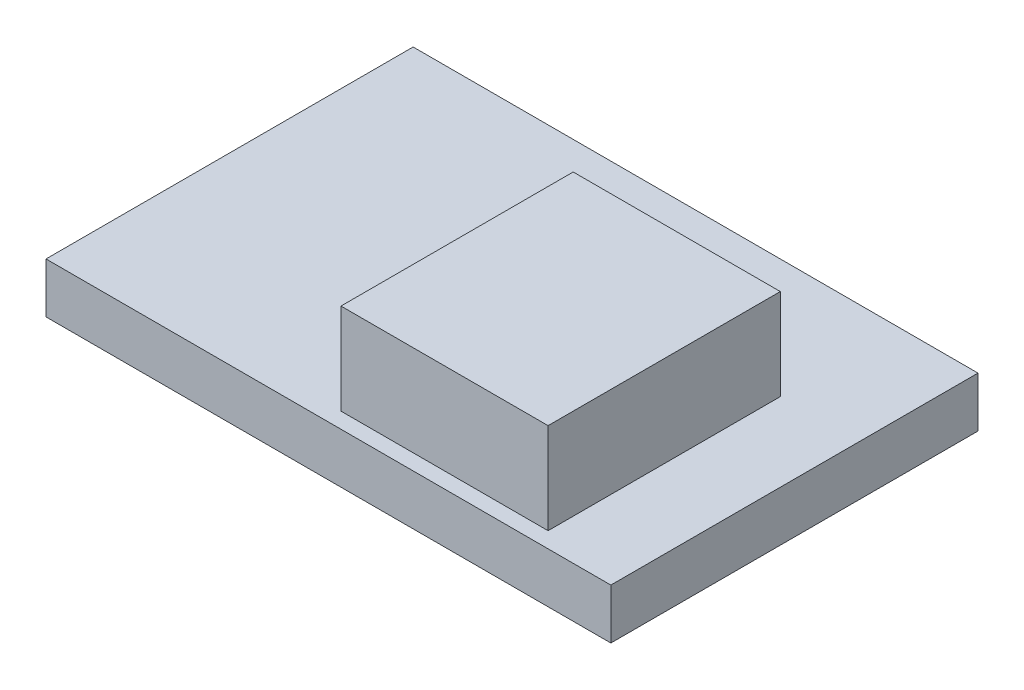
ISO-10303-21;
HEADER;
FILE_DESCRIPTION(('STEP AP214'),'2;1');
FILE_NAME('part.step','',(''),(''),'','','');
FILE_SCHEMA(('AUTOMOTIVE_DESIGN { 1 0 10303 214 1 1 1 1 }'));
ENDSEC;
DATA;
#1=APPLICATION_CONTEXT('core data for automotive mechanical design processes');
#2=APPLICATION_PROTOCOL_DEFINITION('international standard','automotive_design',2000,#1);
#3=PRODUCT_CONTEXT('',#1,'mechanical');
#4=PRODUCT('Part','Part','',(#3));
#5=PRODUCT_RELATED_PRODUCT_CATEGORY('part','',(#4));
#6=PRODUCT_DEFINITION_FORMATION('','',#4);
#7=PRODUCT_DEFINITION_CONTEXT('part definition',#1,'design');
#8=PRODUCT_DEFINITION('design','',#6,#7);
#9=PRODUCT_DEFINITION_SHAPE('','',#8);
#10=(LENGTH_UNIT() NAMED_UNIT(*) SI_UNIT(.MILLI.,.METRE.));
#11=(NAMED_UNIT(*) PLANE_ANGLE_UNIT() SI_UNIT($,.RADIAN.));
#12=(NAMED_UNIT(*) SI_UNIT($,.STERADIAN.) SOLID_ANGLE_UNIT());
#13=UNCERTAINTY_MEASURE_WITH_UNIT(LENGTH_MEASURE(1.E-05),#10,'distance_accuracy_value','');
#14=(GEOMETRIC_REPRESENTATION_CONTEXT(3) GLOBAL_UNCERTAINTY_ASSIGNED_CONTEXT((#13)) GLOBAL_UNIT_ASSIGNED_CONTEXT((#10,
#11,#12)) REPRESENTATION_CONTEXT('',''));
#15=CARTESIAN_POINT('',(0.,0.,0.));
#16=DIRECTION('',(0.,0.,1.));
#17=DIRECTION('',(1.,0.,0.));
#18=AXIS2_PLACEMENT_3D('',#15,#16,#17);
#19=CARTESIAN_POINT('',(0.,1.6,0.));
#20=DIRECTION('',(0.,1.,0.));
#21=DIRECTION('',(0.,0.,1.));
#22=AXIS2_PLACEMENT_3D('',#19,#20,#21);
#23=PLANE('',#22);
#24=DIRECTION('',(0.,0.,1.));
#25=VECTOR('',#24,1.);
#26=CARTESIAN_POINT('',(-9.,1.6,-5.85));
#27=LINE('',#26,#25);
#28=CARTESIAN_POINT('',(-9.,1.6,-5.85));
#29=VERTEX_POINT('',#28);
#30=CARTESIAN_POINT('',(-9.,1.6,5.85));
#31=VERTEX_POINT('',#30);
#32=EDGE_CURVE('E139',#29,#31,#27,.T.);
#33=ORIENTED_EDGE('',*,*,#32,.T.);
#34=DIRECTION('',(1.,0.,0.));
#35=VECTOR('',#34,1.);
#36=CARTESIAN_POINT('',(-9.,1.6,5.85));
#37=LINE('',#36,#35);
#38=CARTESIAN_POINT('',(9.,1.6,5.85));
#39=VERTEX_POINT('',#38);
#40=EDGE_CURVE('E84',#31,#39,#37,.T.);
#41=ORIENTED_EDGE('',*,*,#40,.T.);
#42=DIRECTION('',(0.,0.,-1.));
#43=VECTOR('',#42,1.);
#44=CARTESIAN_POINT('',(9.,1.6,-5.85));
#45=LINE('',#44,#43);
#46=CARTESIAN_POINT('',(9.,1.6,-5.85));
#47=VERTEX_POINT('',#46);
#48=EDGE_CURVE('E142',#39,#47,#45,.T.);
#49=ORIENTED_EDGE('',*,*,#48,.T.);
#50=DIRECTION('',(-1.,0.,0.));
#51=VECTOR('',#50,1.);
#52=CARTESIAN_POINT('',(-9.,1.6,-5.85));
#53=LINE('',#52,#51);
#54=EDGE_CURVE('E56',#47,#29,#53,.T.);
#55=ORIENTED_EDGE('',*,*,#54,.T.);
#56=EDGE_LOOP('',(#33,#41,#49,#55));
#57=FACE_BOUND('',#56,.T.);
#58=DIRECTION('',(1.,0.,0.));
#59=VECTOR('',#58,1.);
#60=CARTESIAN_POINT('',(-0.1,1.6,5.35));
#61=LINE('',#60,#59);
#62=CARTESIAN_POINT('',(-0.1,1.6,5.35));
#63=VERTEX_POINT('',#62);
#64=CARTESIAN_POINT('',(6.5,1.6,5.35));
#65=VERTEX_POINT('',#64);
#66=EDGE_CURVE('E262',#63,#65,#61,.T.);
#67=ORIENTED_EDGE('',*,*,#66,.F.);
#68=DIRECTION('',(0.,0.,1.));
#69=VECTOR('',#68,1.);
#70=CARTESIAN_POINT('',(-0.100000000000001,1.6,-2.05));
#71=LINE('',#70,#69);
#72=CARTESIAN_POINT('',(-0.100000000000001,1.6,-2.05));
#73=VERTEX_POINT('',#72);
#74=EDGE_CURVE('E129',#73,#63,#71,.T.);
#75=ORIENTED_EDGE('',*,*,#74,.F.);
#76=DIRECTION('',(-1.,0.,0.));
#77=VECTOR('',#76,1.);
#78=CARTESIAN_POINT('',(-0.100000000000001,1.6,-2.05));
#79=LINE('',#78,#77);
#80=CARTESIAN_POINT('',(6.5,1.6,-2.05));
#81=VERTEX_POINT('',#80);
#82=EDGE_CURVE('E125',#81,#73,#79,.T.);
#83=ORIENTED_EDGE('',*,*,#82,.F.);
#84=DIRECTION('',(0.,0.,-1.));
#85=VECTOR('',#84,1.);
#86=CARTESIAN_POINT('',(6.5,1.6,-2.05));
#87=LINE('',#86,#85);
#88=EDGE_CURVE('E259',#65,#81,#87,.T.);
#89=ORIENTED_EDGE('',*,*,#88,.F.);
#90=EDGE_LOOP('',(#67,#75,#83,#89));
#91=FACE_BOUND('',#90,.T.);
#92=ADVANCED_FACE('F32',(#57,#91),#23,.T.);
#93=CARTESIAN_POINT('',(-9.,1.6,-5.85));
#94=DIRECTION('',(1.,0.,0.));
#95=DIRECTION('',(0.,0.,-1.));
#96=AXIS2_PLACEMENT_3D('',#93,#94,#95);
#97=PLANE('',#96);
#98=DIRECTION('',(0.,0.,1.));
#99=VECTOR('',#98,1.);
#100=CARTESIAN_POINT('',(-9.,0.,-5.85));
#101=LINE('',#100,#99);
#102=CARTESIAN_POINT('',(-9.,0.,-5.85));
#103=VERTEX_POINT('',#102);
#104=CARTESIAN_POINT('',(-9.,0.,5.85));
#105=VERTEX_POINT('',#104);
#106=EDGE_CURVE('E131',#103,#105,#101,.T.);
#107=ORIENTED_EDGE('',*,*,#106,.T.);
#108=DIRECTION('',(0.,-1.,0.));
#109=VECTOR('',#108,1.);
#110=CARTESIAN_POINT('',(-9.,1.6,5.85));
#111=LINE('',#110,#109);
#112=EDGE_CURVE('E11',#31,#105,#111,.T.);
#113=ORIENTED_EDGE('',*,*,#112,.F.);
#114=ORIENTED_EDGE('',*,*,#32,.F.);
#115=DIRECTION('',(0.,-1.,0.));
#116=VECTOR('',#115,1.);
#117=CARTESIAN_POINT('',(-9.,1.6,-5.85));
#118=LINE('',#117,#116);
#119=EDGE_CURVE('E144',#29,#103,#118,.T.);
#120=ORIENTED_EDGE('',*,*,#119,.T.);
#121=EDGE_LOOP('',(#107,#113,#114,#120));
#122=FACE_BOUND('',#121,.T.);
#123=ADVANCED_FACE('F34',(#122),#97,.F.);
#124=CARTESIAN_POINT('',(-9.,1.6,5.85));
#125=DIRECTION('',(0.,0.,-1.));
#126=DIRECTION('',(-1.,0.,0.));
#127=AXIS2_PLACEMENT_3D('',#124,#125,#126);
#128=PLANE('',#127);
#129=DIRECTION('',(1.,0.,0.));
#130=VECTOR('',#129,1.);
#131=CARTESIAN_POINT('',(-9.,0.,5.85));
#132=LINE('',#131,#130);
#133=CARTESIAN_POINT('',(9.,0.,5.85));
#134=VERTEX_POINT('',#133);
#135=EDGE_CURVE('E134',#105,#134,#132,.T.);
#136=ORIENTED_EDGE('',*,*,#135,.T.);
#137=DIRECTION('',(0.,-1.,0.));
#138=VECTOR('',#137,1.);
#139=CARTESIAN_POINT('',(9.,1.6,5.85));
#140=LINE('',#139,#138);
#141=EDGE_CURVE('E40',#39,#134,#140,.T.);
#142=ORIENTED_EDGE('',*,*,#141,.F.);
#143=ORIENTED_EDGE('',*,*,#40,.F.);
#144=ORIENTED_EDGE('',*,*,#112,.T.);
#145=EDGE_LOOP('',(#136,#142,#143,#144));
#146=FACE_BOUND('',#145,.T.);
#147=ADVANCED_FACE('F172',(#146),#128,.F.);
#148=CARTESIAN_POINT('',(9.,1.6,-5.85));
#149=DIRECTION('',(-1.,0.,0.));
#150=DIRECTION('',(0.,0.,1.));
#151=AXIS2_PLACEMENT_3D('',#148,#149,#150);
#152=PLANE('',#151);
#153=DIRECTION('',(0.,0.,-1.));
#154=VECTOR('',#153,1.);
#155=CARTESIAN_POINT('',(9.,0.,-5.85));
#156=LINE('',#155,#154);
#157=CARTESIAN_POINT('',(9.,0.,-5.85));
#158=VERTEX_POINT('',#157);
#159=EDGE_CURVE('E147',#134,#158,#156,.T.);
#160=ORIENTED_EDGE('',*,*,#159,.T.);
#161=DIRECTION('',(0.,-1.,0.));
#162=VECTOR('',#161,1.);
#163=CARTESIAN_POINT('',(9.,1.6,-5.85));
#164=LINE('',#163,#162);
#165=EDGE_CURVE('E151',#47,#158,#164,.T.);
#166=ORIENTED_EDGE('',*,*,#165,.F.);
#167=ORIENTED_EDGE('',*,*,#48,.F.);
#168=ORIENTED_EDGE('',*,*,#141,.T.);
#169=EDGE_LOOP('',(#160,#166,#167,#168));
#170=FACE_BOUND('',#169,.T.);
#171=ADVANCED_FACE('F156',(#170),#152,.F.);
#172=CARTESIAN_POINT('',(-9.,1.6,-5.85));
#173=DIRECTION('',(0.,0.,1.));
#174=DIRECTION('',(1.,0.,0.));
#175=AXIS2_PLACEMENT_3D('',#172,#173,#174);
#176=PLANE('',#175);
#177=DIRECTION('',(-1.,0.,0.));
#178=VECTOR('',#177,1.);
#179=CARTESIAN_POINT('',(-9.,0.,-5.85));
#180=LINE('',#179,#178);
#181=EDGE_CURVE('E77',#158,#103,#180,.T.);
#182=ORIENTED_EDGE('',*,*,#181,.T.);
#183=ORIENTED_EDGE('',*,*,#119,.F.);
#184=ORIENTED_EDGE('',*,*,#54,.F.);
#185=ORIENTED_EDGE('',*,*,#165,.T.);
#186=EDGE_LOOP('',(#182,#183,#184,#185));
#187=FACE_BOUND('',#186,.T.);
#188=ADVANCED_FACE('F164',(#187),#176,.F.);
#189=CARTESIAN_POINT('',(0.,0.,0.));
#190=DIRECTION('',(0.,1.,0.));
#191=DIRECTION('',(0.,0.,1.));
#192=AXIS2_PLACEMENT_3D('',#189,#190,#191);
#193=PLANE('',#192);
#194=ORIENTED_EDGE('',*,*,#106,.F.);
#195=ORIENTED_EDGE('',*,*,#181,.F.);
#196=ORIENTED_EDGE('',*,*,#159,.F.);
#197=ORIENTED_EDGE('',*,*,#135,.F.);
#198=EDGE_LOOP('',(#194,#195,#196,#197));
#199=FACE_BOUND('',#198,.T.);
#200=ADVANCED_FACE('F160',(#199),#193,.F.);
#201=CARTESIAN_POINT('',(-0.100000000000001,4.5,-2.05));
#202=DIRECTION('',(1.,0.,0.));
#203=DIRECTION('',(0.,0.,-1.));
#204=AXIS2_PLACEMENT_3D('',#201,#202,#203);
#205=PLANE('',#204);
#206=ORIENTED_EDGE('',*,*,#74,.T.);
#207=DIRECTION('',(0.,-1.,0.));
#208=VECTOR('',#207,1.);
#209=CARTESIAN_POINT('',(-0.1,4.5,5.35));
#210=LINE('',#209,#208);
#211=CARTESIAN_POINT('',(-0.1,4.5,5.35));
#212=VERTEX_POINT('',#211);
#213=EDGE_CURVE('E110',#212,#63,#210,.T.);
#214=ORIENTED_EDGE('',*,*,#213,.F.);
#215=DIRECTION('',(0.,0.,1.));
#216=VECTOR('',#215,1.);
#217=CARTESIAN_POINT('',(-0.100000000000001,4.5,-2.05));
#218=LINE('',#217,#216);
#219=CARTESIAN_POINT('',(-0.100000000000001,4.5,-2.05));
#220=VERTEX_POINT('',#219);
#221=EDGE_CURVE('E117',#220,#212,#218,.T.);
#222=ORIENTED_EDGE('',*,*,#221,.F.);
#223=DIRECTION('',(0.,-1.,0.));
#224=VECTOR('',#223,1.);
#225=CARTESIAN_POINT('',(-0.100000000000001,4.5,-2.05));
#226=LINE('',#225,#224);
#227=EDGE_CURVE('E257',#220,#73,#226,.T.);
#228=ORIENTED_EDGE('',*,*,#227,.T.);
#229=EDGE_LOOP('',(#206,#214,#222,#228));
#230=FACE_BOUND('',#229,.T.);
#231=ADVANCED_FACE('F127',(#230),#205,.F.);
#232=CARTESIAN_POINT('',(-0.1,4.5,5.35));
#233=DIRECTION('',(0.,0.,-1.));
#234=DIRECTION('',(-1.,0.,0.));
#235=AXIS2_PLACEMENT_3D('',#232,#233,#234);
#236=PLANE('',#235);
#237=ORIENTED_EDGE('',*,*,#66,.T.);
#238=DIRECTION('',(0.,-1.,0.));
#239=VECTOR('',#238,1.);
#240=CARTESIAN_POINT('',(6.5,4.5,5.35));
#241=LINE('',#240,#239);
#242=CARTESIAN_POINT('',(6.5,4.5,5.35));
#243=VERTEX_POINT('',#242);
#244=EDGE_CURVE('E113',#243,#65,#241,.T.);
#245=ORIENTED_EDGE('',*,*,#244,.F.);
#246=DIRECTION('',(1.,0.,0.));
#247=VECTOR('',#246,1.);
#248=CARTESIAN_POINT('',(-0.1,4.5,5.35));
#249=LINE('',#248,#247);
#250=EDGE_CURVE('E106',#212,#243,#249,.T.);
#251=ORIENTED_EDGE('',*,*,#250,.F.);
#252=ORIENTED_EDGE('',*,*,#213,.T.);
#253=EDGE_LOOP('',(#237,#245,#251,#252));
#254=FACE_BOUND('',#253,.T.);
#255=ADVANCED_FACE('F108',(#254),#236,.F.);
#256=CARTESIAN_POINT('',(6.5,4.5,-2.05));
#257=DIRECTION('',(-1.,0.,0.));
#258=DIRECTION('',(0.,0.,1.));
#259=AXIS2_PLACEMENT_3D('',#256,#257,#258);
#260=PLANE('',#259);
#261=ORIENTED_EDGE('',*,*,#88,.T.);
#262=DIRECTION('',(0.,-1.,0.));
#263=VECTOR('',#262,1.);
#264=CARTESIAN_POINT('',(6.5,4.5,-2.05));
#265=LINE('',#264,#263);
#266=CARTESIAN_POINT('',(6.5,4.5,-2.05));
#267=VERTEX_POINT('',#266);
#268=EDGE_CURVE('E47',#267,#81,#265,.T.);
#269=ORIENTED_EDGE('',*,*,#268,.F.);
#270=DIRECTION('',(0.,0.,-1.));
#271=VECTOR('',#270,1.);
#272=CARTESIAN_POINT('',(6.5,4.5,-2.05));
#273=LINE('',#272,#271);
#274=EDGE_CURVE('E116',#243,#267,#273,.T.);
#275=ORIENTED_EDGE('',*,*,#274,.F.);
#276=ORIENTED_EDGE('',*,*,#244,.T.);
#277=EDGE_LOOP('',(#261,#269,#275,#276));
#278=FACE_BOUND('',#277,.T.);
#279=ADVANCED_FACE('F185',(#278),#260,.F.);
#280=CARTESIAN_POINT('',(-0.100000000000001,4.5,-2.05));
#281=DIRECTION('',(0.,0.,1.));
#282=DIRECTION('',(1.,0.,0.));
#283=AXIS2_PLACEMENT_3D('',#280,#281,#282);
#284=PLANE('',#283);
#285=ORIENTED_EDGE('',*,*,#82,.T.);
#286=ORIENTED_EDGE('',*,*,#227,.F.);
#287=DIRECTION('',(-1.,0.,0.));
#288=VECTOR('',#287,1.);
#289=CARTESIAN_POINT('',(-0.100000000000001,4.5,-2.05));
#290=LINE('',#289,#288);
#291=EDGE_CURVE('E121',#267,#220,#290,.T.);
#292=ORIENTED_EDGE('',*,*,#291,.F.);
#293=ORIENTED_EDGE('',*,*,#268,.T.);
#294=EDGE_LOOP('',(#285,#286,#292,#293));
#295=FACE_BOUND('',#294,.T.);
#296=ADVANCED_FACE('F188',(#295),#284,.F.);
#297=CARTESIAN_POINT('',(0.,4.5,0.));
#298=DIRECTION('',(0.,1.,0.));
#299=DIRECTION('',(0.,0.,1.));
#300=AXIS2_PLACEMENT_3D('',#297,#298,#299);
#301=PLANE('',#300);
#302=ORIENTED_EDGE('',*,*,#221,.T.);
#303=ORIENTED_EDGE('',*,*,#250,.T.);
#304=ORIENTED_EDGE('',*,*,#274,.T.);
#305=ORIENTED_EDGE('',*,*,#291,.T.);
#306=EDGE_LOOP('',(#302,#303,#304,#305));
#307=FACE_BOUND('',#306,.T.);
#308=ADVANCED_FACE('F120',(#307),#301,.T.);
#309=CLOSED_SHELL('',(#92,#123,#147,#171,#188,#200,#231,#255,#279,#296,#308));
#310=MANIFOLD_SOLID_BREP('B2',#309);
#311=ADVANCED_BREP_SHAPE_REPRESENTATION('',(#18,#310),#14);
#312=SHAPE_DEFINITION_REPRESENTATION(#9,#311);
ENDSEC;
END-ISO-10303-21;
